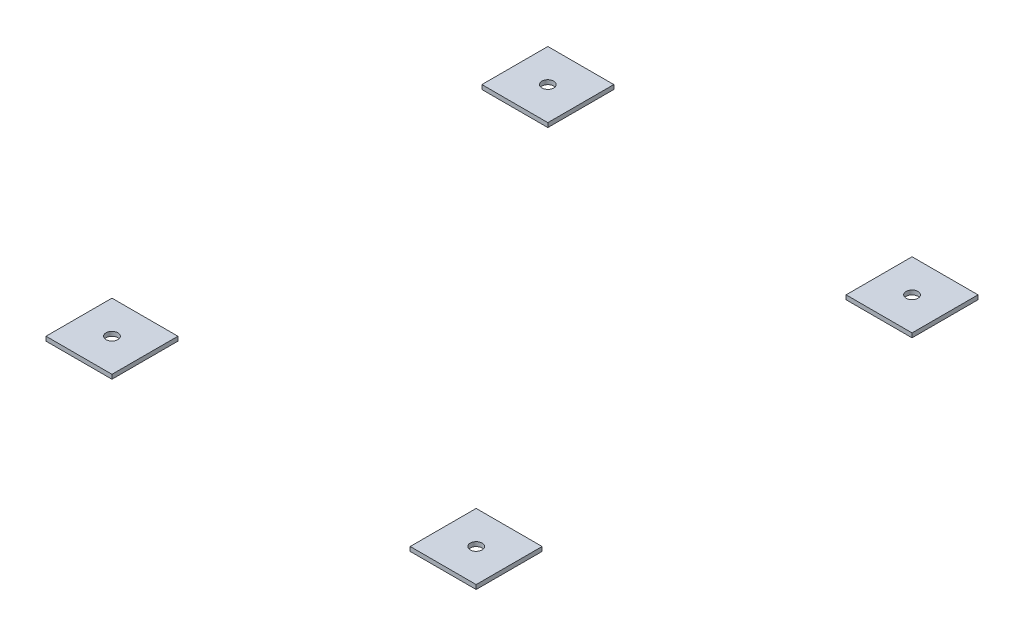
ISO-10303-21;
HEADER;
FILE_DESCRIPTION(('STEP AP214'),'2;1');
FILE_NAME('part.step','',(''),(''),'','','');
FILE_SCHEMA(('AUTOMOTIVE_DESIGN { 1 0 10303 214 1 1 1 1 }'));
ENDSEC;
DATA;
#1=APPLICATION_CONTEXT('core data for automotive mechanical design processes');
#2=APPLICATION_PROTOCOL_DEFINITION('international standard','automotive_design',2000,#1);
#3=PRODUCT_CONTEXT('',#1,'mechanical');
#4=PRODUCT('Part','Part','',(#3));
#5=PRODUCT_RELATED_PRODUCT_CATEGORY('part','',(#4));
#6=PRODUCT_DEFINITION_FORMATION('','',#4);
#7=PRODUCT_DEFINITION_CONTEXT('part definition',#1,'design');
#8=PRODUCT_DEFINITION('design','',#6,#7);
#9=PRODUCT_DEFINITION_SHAPE('','',#8);
#10=(LENGTH_UNIT() NAMED_UNIT(*) SI_UNIT(.MILLI.,.METRE.));
#11=(NAMED_UNIT(*) PLANE_ANGLE_UNIT() SI_UNIT($,.RADIAN.));
#12=(NAMED_UNIT(*) SI_UNIT($,.STERADIAN.) SOLID_ANGLE_UNIT());
#13=UNCERTAINTY_MEASURE_WITH_UNIT(LENGTH_MEASURE(1.E-05),#10,'distance_accuracy_value','');
#14=(GEOMETRIC_REPRESENTATION_CONTEXT(3) GLOBAL_UNCERTAINTY_ASSIGNED_CONTEXT((#13)) GLOBAL_UNIT_ASSIGNED_CONTEXT((#10,
#11,#12)) REPRESENTATION_CONTEXT('',''));
#15=CARTESIAN_POINT('',(0.,0.,0.));
#16=DIRECTION('',(0.,0.,1.));
#17=DIRECTION('',(1.,0.,0.));
#18=AXIS2_PLACEMENT_3D('',#15,#16,#17);
#19=CARTESIAN_POINT('',(0.,1.5,0.));
#20=DIRECTION('',(0.,-1.,0.));
#21=DIRECTION('',(0.,0.,-1.));
#22=AXIS2_PLACEMENT_3D('',#19,#20,#21);
#23=PLANE('',#22);
#24=DIRECTION('',(0.,0.,1.));
#25=VECTOR('',#24,1.);
#26=CARTESIAN_POINT('',(-150.,1.5,175.));
#27=LINE('',#26,#25);
#28=CARTESIAN_POINT('',(-150.,1.5,129.));
#29=VERTEX_POINT('',#28);
#30=CARTESIAN_POINT('',(-150.,1.5,175.));
#31=VERTEX_POINT('',#30);
#32=EDGE_CURVE('E114',#29,#31,#27,.T.);
#33=ORIENTED_EDGE('',*,*,#32,.T.);
#34=DIRECTION('',(1.,0.,0.));
#35=VECTOR('',#34,1.);
#36=CARTESIAN_POINT('',(-150.,1.5,175.));
#37=LINE('',#36,#35);
#38=CARTESIAN_POINT('',(-104.,1.5,175.));
#39=VERTEX_POINT('',#38);
#40=EDGE_CURVE('E83',#31,#39,#37,.T.);
#41=ORIENTED_EDGE('',*,*,#40,.T.);
#42=DIRECTION('',(0.,0.,-1.));
#43=VECTOR('',#42,1.);
#44=CARTESIAN_POINT('',(-104.,1.5,175.));
#45=LINE('',#44,#43);
#46=CARTESIAN_POINT('',(-104.,1.5,129.));
#47=VERTEX_POINT('',#46);
#48=EDGE_CURVE('E122',#39,#47,#45,.T.);
#49=ORIENTED_EDGE('',*,*,#48,.T.);
#50=DIRECTION('',(-1.,0.,0.));
#51=VECTOR('',#50,1.);
#52=CARTESIAN_POINT('',(-150.,1.5,129.));
#53=LINE('',#52,#51);
#54=EDGE_CURVE('E107',#47,#29,#53,.T.);
#55=ORIENTED_EDGE('',*,*,#54,.T.);
#56=EDGE_LOOP('',(#33,#41,#49,#55));
#57=FACE_BOUND('',#56,.T.);
#58=CARTESIAN_POINT('',(-127.,1.5,152.));
#59=DIRECTION('',(0.,1.,0.));
#60=DIRECTION('',(0.,0.,1.));
#61=AXIS2_PLACEMENT_3D('',#58,#59,#60);
#62=CIRCLE('',#61,4.14);
#63=CARTESIAN_POINT('',(-127.,1.5,156.14));
#64=VERTEX_POINT('',#63);
#65=EDGE_CURVE('E54',#64,#64,#62,.T.);
#66=ORIENTED_EDGE('',*,*,#65,.F.);
#67=EDGE_LOOP('',(#66));
#68=FACE_BOUND('',#67,.T.);
#69=ADVANCED_FACE('F50',(#57,#68),#23,.F.);
#70=CARTESIAN_POINT('',(0.,-1.5,0.));
#71=DIRECTION('',(0.,-1.,0.));
#72=DIRECTION('',(0.,0.,-1.));
#73=AXIS2_PLACEMENT_3D('',#70,#71,#72);
#74=PLANE('',#73);
#75=DIRECTION('',(0.,0.,1.));
#76=VECTOR('',#75,1.);
#77=CARTESIAN_POINT('',(-150.,-1.5,175.));
#78=LINE('',#77,#76);
#79=CARTESIAN_POINT('',(-150.,-1.5,129.));
#80=VERTEX_POINT('',#79);
#81=CARTESIAN_POINT('',(-150.,-1.5,175.));
#82=VERTEX_POINT('',#81);
#83=EDGE_CURVE('E113',#80,#82,#78,.T.);
#84=ORIENTED_EDGE('',*,*,#83,.F.);
#85=DIRECTION('',(-1.,0.,0.));
#86=VECTOR('',#85,1.);
#87=CARTESIAN_POINT('',(-150.,-1.5,129.));
#88=LINE('',#87,#86);
#89=CARTESIAN_POINT('',(-104.,-1.5,129.));
#90=VERTEX_POINT('',#89);
#91=EDGE_CURVE('E93',#90,#80,#88,.T.);
#92=ORIENTED_EDGE('',*,*,#91,.F.);
#93=DIRECTION('',(0.,0.,-1.));
#94=VECTOR('',#93,1.);
#95=CARTESIAN_POINT('',(-104.,-1.5,175.));
#96=LINE('',#95,#94);
#97=CARTESIAN_POINT('',(-104.,-1.5,175.));
#98=VERTEX_POINT('',#97);
#99=EDGE_CURVE('E99',#98,#90,#96,.T.);
#100=ORIENTED_EDGE('',*,*,#99,.F.);
#101=DIRECTION('',(1.,0.,0.));
#102=VECTOR('',#101,1.);
#103=CARTESIAN_POINT('',(-150.,-1.5,175.));
#104=LINE('',#103,#102);
#105=EDGE_CURVE('E67',#82,#98,#104,.T.);
#106=ORIENTED_EDGE('',*,*,#105,.F.);
#107=EDGE_LOOP('',(#84,#92,#100,#106));
#108=FACE_BOUND('',#107,.T.);
#109=CARTESIAN_POINT('',(-127.,-1.5,152.));
#110=DIRECTION('',(0.,1.,0.));
#111=DIRECTION('',(0.,0.,1.));
#112=AXIS2_PLACEMENT_3D('',#109,#110,#111);
#113=CIRCLE('',#112,4.14);
#114=CARTESIAN_POINT('',(-127.,-1.5,156.14));
#115=VERTEX_POINT('',#114);
#116=EDGE_CURVE('E12',#115,#115,#113,.T.);
#117=ORIENTED_EDGE('',*,*,#116,.T.);
#118=EDGE_LOOP('',(#117));
#119=FACE_BOUND('',#118,.T.);
#120=ADVANCED_FACE('F110',(#108,#119),#74,.T.);
#121=CARTESIAN_POINT('',(-150.,1.5,175.));
#122=DIRECTION('',(1.,0.,0.));
#123=DIRECTION('',(0.,0.,-1.));
#124=AXIS2_PLACEMENT_3D('',#121,#122,#123);
#125=PLANE('',#124);
#126=ORIENTED_EDGE('',*,*,#83,.T.);
#127=DIRECTION('',(0.,-1.,0.));
#128=VECTOR('',#127,1.);
#129=CARTESIAN_POINT('',(-150.,1.5,175.));
#130=LINE('',#129,#128);
#131=EDGE_CURVE('E129',#31,#82,#130,.T.);
#132=ORIENTED_EDGE('',*,*,#131,.F.);
#133=ORIENTED_EDGE('',*,*,#32,.F.);
#134=DIRECTION('',(0.,-1.,0.));
#135=VECTOR('',#134,1.);
#136=CARTESIAN_POINT('',(-150.,1.5,129.));
#137=LINE('',#136,#135);
#138=EDGE_CURVE('E108',#29,#80,#137,.T.);
#139=ORIENTED_EDGE('',*,*,#138,.T.);
#140=EDGE_LOOP('',(#126,#132,#133,#139));
#141=FACE_BOUND('',#140,.T.);
#142=ADVANCED_FACE('F128',(#141),#125,.F.);
#143=CARTESIAN_POINT('',(-150.,1.5,175.));
#144=DIRECTION('',(0.,0.,-1.));
#145=DIRECTION('',(-1.,0.,0.));
#146=AXIS2_PLACEMENT_3D('',#143,#144,#145);
#147=PLANE('',#146);
#148=ORIENTED_EDGE('',*,*,#105,.T.);
#149=DIRECTION('',(0.,-1.,0.));
#150=VECTOR('',#149,1.);
#151=CARTESIAN_POINT('',(-104.,1.5,175.));
#152=LINE('',#151,#150);
#153=EDGE_CURVE('E104',#39,#98,#152,.T.);
#154=ORIENTED_EDGE('',*,*,#153,.F.);
#155=ORIENTED_EDGE('',*,*,#40,.F.);
#156=ORIENTED_EDGE('',*,*,#131,.T.);
#157=EDGE_LOOP('',(#148,#154,#155,#156));
#158=FACE_BOUND('',#157,.T.);
#159=ADVANCED_FACE('F132',(#158),#147,.F.);
#160=CARTESIAN_POINT('',(-104.,1.5,175.));
#161=DIRECTION('',(-1.,0.,0.));
#162=DIRECTION('',(0.,0.,1.));
#163=AXIS2_PLACEMENT_3D('',#160,#161,#162);
#164=PLANE('',#163);
#165=ORIENTED_EDGE('',*,*,#99,.T.);
#166=DIRECTION('',(0.,-1.,0.));
#167=VECTOR('',#166,1.);
#168=CARTESIAN_POINT('',(-104.,1.5,129.));
#169=LINE('',#168,#167);
#170=EDGE_CURVE('E102',#47,#90,#169,.T.);
#171=ORIENTED_EDGE('',*,*,#170,.F.);
#172=ORIENTED_EDGE('',*,*,#48,.F.);
#173=ORIENTED_EDGE('',*,*,#153,.T.);
#174=EDGE_LOOP('',(#165,#171,#172,#173));
#175=FACE_BOUND('',#174,.T.);
#176=ADVANCED_FACE('F100',(#175),#164,.F.);
#177=CARTESIAN_POINT('',(-150.,1.5,129.));
#178=DIRECTION('',(0.,0.,1.));
#179=DIRECTION('',(1.,0.,0.));
#180=AXIS2_PLACEMENT_3D('',#177,#178,#179);
#181=PLANE('',#180);
#182=ORIENTED_EDGE('',*,*,#91,.T.);
#183=ORIENTED_EDGE('',*,*,#138,.F.);
#184=ORIENTED_EDGE('',*,*,#54,.F.);
#185=ORIENTED_EDGE('',*,*,#170,.T.);
#186=EDGE_LOOP('',(#182,#183,#184,#185));
#187=FACE_BOUND('',#186,.T.);
#188=ADVANCED_FACE('F106',(#187),#181,.F.);
#189=CARTESIAN_POINT('',(-127.,1.5,152.));
#190=DIRECTION('',(0.,-1.,0.));
#191=DIRECTION('',(0.,0.,-1.));
#192=AXIS2_PLACEMENT_3D('',#189,#190,#191);
#193=CYLINDRICAL_SURFACE('',#192,4.14);
#194=ORIENTED_EDGE('',*,*,#65,.T.);
#195=EDGE_LOOP('',(#194));
#196=FACE_BOUND('',#195,.T.);
#197=ORIENTED_EDGE('',*,*,#116,.F.);
#198=EDGE_LOOP('',(#197));
#199=FACE_BOUND('',#198,.T.);
#200=ADVANCED_FACE('F52',(#196,#199),#193,.F.);
#201=CLOSED_SHELL('',(#69,#120,#142,#159,#176,#188,#200));
#202=MANIFOLD_SOLID_BREP('B2',#201);
#203=CARTESIAN_POINT('',(0.,1.5,0.));
#204=DIRECTION('',(0.,-1.,0.));
#205=DIRECTION('',(0.,0.,-1.));
#206=AXIS2_PLACEMENT_3D('',#203,#204,#205);
#207=PLANE('',#206);
#208=DIRECTION('',(0.,0.,1.));
#209=VECTOR('',#208,1.);
#210=CARTESIAN_POINT('',(104.,1.5,175.));
#211=LINE('',#210,#209);
#212=CARTESIAN_POINT('',(104.,1.5,129.));
#213=VERTEX_POINT('',#212);
#214=CARTESIAN_POINT('',(104.,1.5,175.));
#215=VERTEX_POINT('',#214);
#216=EDGE_CURVE('E269',#213,#215,#211,.T.);
#217=ORIENTED_EDGE('',*,*,#216,.T.);
#218=DIRECTION('',(1.,0.,0.));
#219=VECTOR('',#218,1.);
#220=CARTESIAN_POINT('',(104.,1.5,175.));
#221=LINE('',#220,#219);
#222=CARTESIAN_POINT('',(150.,1.5,175.));
#223=VERTEX_POINT('',#222);
#224=EDGE_CURVE('E238',#215,#223,#221,.T.);
#225=ORIENTED_EDGE('',*,*,#224,.T.);
#226=DIRECTION('',(0.,0.,-1.));
#227=VECTOR('',#226,1.);
#228=CARTESIAN_POINT('',(150.,1.5,175.));
#229=LINE('',#228,#227);
#230=CARTESIAN_POINT('',(150.,1.5,129.));
#231=VERTEX_POINT('',#230);
#232=EDGE_CURVE('E277',#223,#231,#229,.T.);
#233=ORIENTED_EDGE('',*,*,#232,.T.);
#234=DIRECTION('',(-1.,0.,0.));
#235=VECTOR('',#234,1.);
#236=CARTESIAN_POINT('',(104.,1.5,129.));
#237=LINE('',#236,#235);
#238=EDGE_CURVE('E262',#231,#213,#237,.T.);
#239=ORIENTED_EDGE('',*,*,#238,.T.);
#240=EDGE_LOOP('',(#217,#225,#233,#239));
#241=FACE_BOUND('',#240,.T.);
#242=CARTESIAN_POINT('',(127.,1.5,152.));
#243=DIRECTION('',(0.,1.,0.));
#244=DIRECTION('',(0.,0.,1.));
#245=AXIS2_PLACEMENT_3D('',#242,#243,#244);
#246=CIRCLE('',#245,4.14);
#247=CARTESIAN_POINT('',(127.,1.5,156.14));
#248=VERTEX_POINT('',#247);
#249=EDGE_CURVE('E209',#248,#248,#246,.T.);
#250=ORIENTED_EDGE('',*,*,#249,.F.);
#251=EDGE_LOOP('',(#250));
#252=FACE_BOUND('',#251,.T.);
#253=ADVANCED_FACE('F205',(#241,#252),#207,.F.);
#254=CARTESIAN_POINT('',(0.,-1.5,0.));
#255=DIRECTION('',(0.,-1.,0.));
#256=DIRECTION('',(0.,0.,-1.));
#257=AXIS2_PLACEMENT_3D('',#254,#255,#256);
#258=PLANE('',#257);
#259=DIRECTION('',(0.,0.,1.));
#260=VECTOR('',#259,1.);
#261=CARTESIAN_POINT('',(104.,-1.5,175.));
#262=LINE('',#261,#260);
#263=CARTESIAN_POINT('',(104.,-1.5,129.));
#264=VERTEX_POINT('',#263);
#265=CARTESIAN_POINT('',(104.,-1.5,175.));
#266=VERTEX_POINT('',#265);
#267=EDGE_CURVE('E268',#264,#266,#262,.T.);
#268=ORIENTED_EDGE('',*,*,#267,.F.);
#269=DIRECTION('',(-1.,0.,0.));
#270=VECTOR('',#269,1.);
#271=CARTESIAN_POINT('',(104.,-1.5,129.));
#272=LINE('',#271,#270);
#273=CARTESIAN_POINT('',(150.,-1.5,129.));
#274=VERTEX_POINT('',#273);
#275=EDGE_CURVE('E248',#274,#264,#272,.T.);
#276=ORIENTED_EDGE('',*,*,#275,.F.);
#277=DIRECTION('',(0.,0.,-1.));
#278=VECTOR('',#277,1.);
#279=CARTESIAN_POINT('',(150.,-1.5,175.));
#280=LINE('',#279,#278);
#281=CARTESIAN_POINT('',(150.,-1.5,175.));
#282=VERTEX_POINT('',#281);
#283=EDGE_CURVE('E254',#282,#274,#280,.T.);
#284=ORIENTED_EDGE('',*,*,#283,.F.);
#285=DIRECTION('',(1.,0.,0.));
#286=VECTOR('',#285,1.);
#287=CARTESIAN_POINT('',(104.,-1.5,175.));
#288=LINE('',#287,#286);
#289=EDGE_CURVE('E222',#266,#282,#288,.T.);
#290=ORIENTED_EDGE('',*,*,#289,.F.);
#291=EDGE_LOOP('',(#268,#276,#284,#290));
#292=FACE_BOUND('',#291,.T.);
#293=CARTESIAN_POINT('',(127.,-1.5,152.));
#294=DIRECTION('',(0.,1.,0.));
#295=DIRECTION('',(0.,0.,1.));
#296=AXIS2_PLACEMENT_3D('',#293,#294,#295);
#297=CIRCLE('',#296,4.14);
#298=CARTESIAN_POINT('',(127.,-1.5,156.14));
#299=VERTEX_POINT('',#298);
#300=EDGE_CURVE('E48',#299,#299,#297,.T.);
#301=ORIENTED_EDGE('',*,*,#300,.T.);
#302=EDGE_LOOP('',(#301));
#303=FACE_BOUND('',#302,.T.);
#304=ADVANCED_FACE('F265',(#292,#303),#258,.T.);
#305=CARTESIAN_POINT('',(104.,1.5,175.));
#306=DIRECTION('',(1.,0.,0.));
#307=DIRECTION('',(0.,0.,-1.));
#308=AXIS2_PLACEMENT_3D('',#305,#306,#307);
#309=PLANE('',#308);
#310=ORIENTED_EDGE('',*,*,#267,.T.);
#311=DIRECTION('',(0.,-1.,0.));
#312=VECTOR('',#311,1.);
#313=CARTESIAN_POINT('',(104.,1.5,175.));
#314=LINE('',#313,#312);
#315=EDGE_CURVE('E284',#215,#266,#314,.T.);
#316=ORIENTED_EDGE('',*,*,#315,.F.);
#317=ORIENTED_EDGE('',*,*,#216,.F.);
#318=DIRECTION('',(0.,-1.,0.));
#319=VECTOR('',#318,1.);
#320=CARTESIAN_POINT('',(104.,1.5,129.));
#321=LINE('',#320,#319);
#322=EDGE_CURVE('E263',#213,#264,#321,.T.);
#323=ORIENTED_EDGE('',*,*,#322,.T.);
#324=EDGE_LOOP('',(#310,#316,#317,#323));
#325=FACE_BOUND('',#324,.T.);
#326=ADVANCED_FACE('F283',(#325),#309,.F.);
#327=CARTESIAN_POINT('',(104.,1.5,175.));
#328=DIRECTION('',(0.,0.,-1.));
#329=DIRECTION('',(-1.,0.,0.));
#330=AXIS2_PLACEMENT_3D('',#327,#328,#329);
#331=PLANE('',#330);
#332=ORIENTED_EDGE('',*,*,#289,.T.);
#333=DIRECTION('',(0.,-1.,0.));
#334=VECTOR('',#333,1.);
#335=CARTESIAN_POINT('',(150.,1.5,175.));
#336=LINE('',#335,#334);
#337=EDGE_CURVE('E259',#223,#282,#336,.T.);
#338=ORIENTED_EDGE('',*,*,#337,.F.);
#339=ORIENTED_EDGE('',*,*,#224,.F.);
#340=ORIENTED_EDGE('',*,*,#315,.T.);
#341=EDGE_LOOP('',(#332,#338,#339,#340));
#342=FACE_BOUND('',#341,.T.);
#343=ADVANCED_FACE('F287',(#342),#331,.F.);
#344=CARTESIAN_POINT('',(150.,1.5,175.));
#345=DIRECTION('',(-1.,0.,0.));
#346=DIRECTION('',(0.,0.,1.));
#347=AXIS2_PLACEMENT_3D('',#344,#345,#346);
#348=PLANE('',#347);
#349=ORIENTED_EDGE('',*,*,#283,.T.);
#350=DIRECTION('',(0.,-1.,0.));
#351=VECTOR('',#350,1.);
#352=CARTESIAN_POINT('',(150.,1.5,129.));
#353=LINE('',#352,#351);
#354=EDGE_CURVE('E257',#231,#274,#353,.T.);
#355=ORIENTED_EDGE('',*,*,#354,.F.);
#356=ORIENTED_EDGE('',*,*,#232,.F.);
#357=ORIENTED_EDGE('',*,*,#337,.T.);
#358=EDGE_LOOP('',(#349,#355,#356,#357));
#359=FACE_BOUND('',#358,.T.);
#360=ADVANCED_FACE('F255',(#359),#348,.F.);
#361=CARTESIAN_POINT('',(104.,1.5,129.));
#362=DIRECTION('',(0.,0.,1.));
#363=DIRECTION('',(1.,0.,0.));
#364=AXIS2_PLACEMENT_3D('',#361,#362,#363);
#365=PLANE('',#364);
#366=ORIENTED_EDGE('',*,*,#275,.T.);
#367=ORIENTED_EDGE('',*,*,#322,.F.);
#368=ORIENTED_EDGE('',*,*,#238,.F.);
#369=ORIENTED_EDGE('',*,*,#354,.T.);
#370=EDGE_LOOP('',(#366,#367,#368,#369));
#371=FACE_BOUND('',#370,.T.);
#372=ADVANCED_FACE('F261',(#371),#365,.F.);
#373=CARTESIAN_POINT('',(127.,1.5,152.));
#374=DIRECTION('',(0.,-1.,0.));
#375=DIRECTION('',(0.,0.,-1.));
#376=AXIS2_PLACEMENT_3D('',#373,#374,#375);
#377=CYLINDRICAL_SURFACE('',#376,4.14);
#378=ORIENTED_EDGE('',*,*,#249,.T.);
#379=EDGE_LOOP('',(#378));
#380=FACE_BOUND('',#379,.T.);
#381=ORIENTED_EDGE('',*,*,#300,.F.);
#382=EDGE_LOOP('',(#381));
#383=FACE_BOUND('',#382,.T.);
#384=ADVANCED_FACE('F207',(#380,#383),#377,.F.);
#385=CLOSED_SHELL('',(#253,#304,#326,#343,#360,#372,#384));
#386=MANIFOLD_SOLID_BREP('B6',#385);
#387=CARTESIAN_POINT('',(0.,1.5,0.));
#388=DIRECTION('',(0.,-1.,0.));
#389=DIRECTION('',(0.,0.,-1.));
#390=AXIS2_PLACEMENT_3D('',#387,#388,#389);
#391=PLANE('',#390);
#392=DIRECTION('',(0.,0.,1.));
#393=VECTOR('',#392,1.);
#394=CARTESIAN_POINT('',(-150.,1.5,-129.));
#395=LINE('',#394,#393);
#396=CARTESIAN_POINT('',(-150.,1.5,-175.));
#397=VERTEX_POINT('',#396);
#398=CARTESIAN_POINT('',(-150.,1.5,-129.));
#399=VERTEX_POINT('',#398);
#400=EDGE_CURVE('E423',#397,#399,#395,.T.);
#401=ORIENTED_EDGE('',*,*,#400,.T.);
#402=DIRECTION('',(1.,0.,0.));
#403=VECTOR('',#402,1.);
#404=CARTESIAN_POINT('',(-150.,1.5,-129.));
#405=LINE('',#404,#403);
#406=CARTESIAN_POINT('',(-104.,1.5,-129.));
#407=VERTEX_POINT('',#406);
#408=EDGE_CURVE('E392',#399,#407,#405,.T.);
#409=ORIENTED_EDGE('',*,*,#408,.T.);
#410=DIRECTION('',(0.,0.,-1.));
#411=VECTOR('',#410,1.);
#412=CARTESIAN_POINT('',(-104.,1.5,-129.));
#413=LINE('',#412,#411);
#414=CARTESIAN_POINT('',(-104.,1.5,-175.));
#415=VERTEX_POINT('',#414);
#416=EDGE_CURVE('E431',#407,#415,#413,.T.);
#417=ORIENTED_EDGE('',*,*,#416,.T.);
#418=DIRECTION('',(-1.,0.,0.));
#419=VECTOR('',#418,1.);
#420=CARTESIAN_POINT('',(-150.,1.5,-175.));
#421=LINE('',#420,#419);
#422=EDGE_CURVE('E416',#415,#397,#421,.T.);
#423=ORIENTED_EDGE('',*,*,#422,.T.);
#424=EDGE_LOOP('',(#401,#409,#417,#423));
#425=FACE_BOUND('',#424,.T.);
#426=CARTESIAN_POINT('',(-127.,1.5,-152.));
#427=DIRECTION('',(0.,1.,0.));
#428=DIRECTION('',(0.,0.,1.));
#429=AXIS2_PLACEMENT_3D('',#426,#427,#428);
#430=CIRCLE('',#429,4.14);
#431=CARTESIAN_POINT('',(-127.,1.5,-147.86));
#432=VERTEX_POINT('',#431);
#433=EDGE_CURVE('E363',#432,#432,#430,.T.);
#434=ORIENTED_EDGE('',*,*,#433,.F.);
#435=EDGE_LOOP('',(#434));
#436=FACE_BOUND('',#435,.T.);
#437=ADVANCED_FACE('F359',(#425,#436),#391,.F.);
#438=CARTESIAN_POINT('',(0.,-1.5,0.));
#439=DIRECTION('',(0.,-1.,0.));
#440=DIRECTION('',(0.,0.,-1.));
#441=AXIS2_PLACEMENT_3D('',#438,#439,#440);
#442=PLANE('',#441);
#443=DIRECTION('',(0.,0.,1.));
#444=VECTOR('',#443,1.);
#445=CARTESIAN_POINT('',(-150.,-1.5,-129.));
#446=LINE('',#445,#444);
#447=CARTESIAN_POINT('',(-150.,-1.5,-175.));
#448=VERTEX_POINT('',#447);
#449=CARTESIAN_POINT('',(-150.,-1.5,-129.));
#450=VERTEX_POINT('',#449);
#451=EDGE_CURVE('E422',#448,#450,#446,.T.);
#452=ORIENTED_EDGE('',*,*,#451,.F.);
#453=DIRECTION('',(-1.,0.,0.));
#454=VECTOR('',#453,1.);
#455=CARTESIAN_POINT('',(-150.,-1.5,-175.));
#456=LINE('',#455,#454);
#457=CARTESIAN_POINT('',(-104.,-1.5,-175.));
#458=VERTEX_POINT('',#457);
#459=EDGE_CURVE('E402',#458,#448,#456,.T.);
#460=ORIENTED_EDGE('',*,*,#459,.F.);
#461=DIRECTION('',(0.,0.,-1.));
#462=VECTOR('',#461,1.);
#463=CARTESIAN_POINT('',(-104.,-1.5,-129.));
#464=LINE('',#463,#462);
#465=CARTESIAN_POINT('',(-104.,-1.5,-129.));
#466=VERTEX_POINT('',#465);
#467=EDGE_CURVE('E408',#466,#458,#464,.T.);
#468=ORIENTED_EDGE('',*,*,#467,.F.);
#469=DIRECTION('',(1.,0.,0.));
#470=VECTOR('',#469,1.);
#471=CARTESIAN_POINT('',(-150.,-1.5,-129.));
#472=LINE('',#471,#470);
#473=EDGE_CURVE('E376',#450,#466,#472,.T.);
#474=ORIENTED_EDGE('',*,*,#473,.F.);
#475=EDGE_LOOP('',(#452,#460,#468,#474));
#476=FACE_BOUND('',#475,.T.);
#477=CARTESIAN_POINT('',(-127.,-1.5,-152.));
#478=DIRECTION('',(0.,1.,0.));
#479=DIRECTION('',(0.,0.,1.));
#480=AXIS2_PLACEMENT_3D('',#477,#478,#479);
#481=CIRCLE('',#480,4.14);
#482=CARTESIAN_POINT('',(-127.,-1.5,-147.86));
#483=VERTEX_POINT('',#482);
#484=EDGE_CURVE('E203',#483,#483,#481,.T.);
#485=ORIENTED_EDGE('',*,*,#484,.T.);
#486=EDGE_LOOP('',(#485));
#487=FACE_BOUND('',#486,.T.);
#488=ADVANCED_FACE('F419',(#476,#487),#442,.T.);
#489=CARTESIAN_POINT('',(-150.,1.5,-129.));
#490=DIRECTION('',(1.,0.,0.));
#491=DIRECTION('',(0.,0.,-1.));
#492=AXIS2_PLACEMENT_3D('',#489,#490,#491);
#493=PLANE('',#492);
#494=ORIENTED_EDGE('',*,*,#451,.T.);
#495=DIRECTION('',(0.,-1.,0.));
#496=VECTOR('',#495,1.);
#497=CARTESIAN_POINT('',(-150.,1.5,-129.));
#498=LINE('',#497,#496);
#499=EDGE_CURVE('E438',#399,#450,#498,.T.);
#500=ORIENTED_EDGE('',*,*,#499,.F.);
#501=ORIENTED_EDGE('',*,*,#400,.F.);
#502=DIRECTION('',(0.,-1.,0.));
#503=VECTOR('',#502,1.);
#504=CARTESIAN_POINT('',(-150.,1.5,-175.));
#505=LINE('',#504,#503);
#506=EDGE_CURVE('E417',#397,#448,#505,.T.);
#507=ORIENTED_EDGE('',*,*,#506,.T.);
#508=EDGE_LOOP('',(#494,#500,#501,#507));
#509=FACE_BOUND('',#508,.T.);
#510=ADVANCED_FACE('F437',(#509),#493,.F.);
#511=CARTESIAN_POINT('',(-150.,1.5,-129.));
#512=DIRECTION('',(0.,0.,-1.));
#513=DIRECTION('',(-1.,0.,0.));
#514=AXIS2_PLACEMENT_3D('',#511,#512,#513);
#515=PLANE('',#514);
#516=ORIENTED_EDGE('',*,*,#473,.T.);
#517=DIRECTION('',(0.,-1.,0.));
#518=VECTOR('',#517,1.);
#519=CARTESIAN_POINT('',(-104.,1.5,-129.));
#520=LINE('',#519,#518);
#521=EDGE_CURVE('E413',#407,#466,#520,.T.);
#522=ORIENTED_EDGE('',*,*,#521,.F.);
#523=ORIENTED_EDGE('',*,*,#408,.F.);
#524=ORIENTED_EDGE('',*,*,#499,.T.);
#525=EDGE_LOOP('',(#516,#522,#523,#524));
#526=FACE_BOUND('',#525,.T.);
#527=ADVANCED_FACE('F441',(#526),#515,.F.);
#528=CARTESIAN_POINT('',(-104.,1.5,-129.));
#529=DIRECTION('',(-1.,0.,0.));
#530=DIRECTION('',(0.,0.,1.));
#531=AXIS2_PLACEMENT_3D('',#528,#529,#530);
#532=PLANE('',#531);
#533=ORIENTED_EDGE('',*,*,#467,.T.);
#534=DIRECTION('',(0.,-1.,0.));
#535=VECTOR('',#534,1.);
#536=CARTESIAN_POINT('',(-104.,1.5,-175.));
#537=LINE('',#536,#535);
#538=EDGE_CURVE('E411',#415,#458,#537,.T.);
#539=ORIENTED_EDGE('',*,*,#538,.F.);
#540=ORIENTED_EDGE('',*,*,#416,.F.);
#541=ORIENTED_EDGE('',*,*,#521,.T.);
#542=EDGE_LOOP('',(#533,#539,#540,#541));
#543=FACE_BOUND('',#542,.T.);
#544=ADVANCED_FACE('F409',(#543),#532,.F.);
#545=CARTESIAN_POINT('',(-150.,1.5,-175.));
#546=DIRECTION('',(0.,0.,1.));
#547=DIRECTION('',(1.,0.,0.));
#548=AXIS2_PLACEMENT_3D('',#545,#546,#547);
#549=PLANE('',#548);
#550=ORIENTED_EDGE('',*,*,#459,.T.);
#551=ORIENTED_EDGE('',*,*,#506,.F.);
#552=ORIENTED_EDGE('',*,*,#422,.F.);
#553=ORIENTED_EDGE('',*,*,#538,.T.);
#554=EDGE_LOOP('',(#550,#551,#552,#553));
#555=FACE_BOUND('',#554,.T.);
#556=ADVANCED_FACE('F415',(#555),#549,.F.);
#557=CARTESIAN_POINT('',(-127.,1.5,-152.));
#558=DIRECTION('',(0.,-1.,0.));
#559=DIRECTION('',(0.,0.,-1.));
#560=AXIS2_PLACEMENT_3D('',#557,#558,#559);
#561=CYLINDRICAL_SURFACE('',#560,4.14);
#562=ORIENTED_EDGE('',*,*,#433,.T.);
#563=EDGE_LOOP('',(#562));
#564=FACE_BOUND('',#563,.T.);
#565=ORIENTED_EDGE('',*,*,#484,.F.);
#566=EDGE_LOOP('',(#565));
#567=FACE_BOUND('',#566,.T.);
#568=ADVANCED_FACE('F361',(#564,#567),#561,.F.);
#569=CLOSED_SHELL('',(#437,#488,#510,#527,#544,#556,#568));
#570=MANIFOLD_SOLID_BREP('B42',#569);
#571=CARTESIAN_POINT('',(0.,1.5,0.));
#572=DIRECTION('',(0.,-1.,0.));
#573=DIRECTION('',(0.,0.,-1.));
#574=AXIS2_PLACEMENT_3D('',#571,#572,#573);
#575=PLANE('',#574);
#576=DIRECTION('',(0.,0.,1.));
#577=VECTOR('',#576,1.);
#578=CARTESIAN_POINT('',(104.,1.5,-129.));
#579=LINE('',#578,#577);
#580=CARTESIAN_POINT('',(104.,1.5,-175.));
#581=VERTEX_POINT('',#580);
#582=CARTESIAN_POINT('',(104.,1.5,-129.));
#583=VERTEX_POINT('',#582);
#584=EDGE_CURVE('E556',#581,#583,#579,.T.);
#585=ORIENTED_EDGE('',*,*,#584,.T.);
#586=DIRECTION('',(1.,0.,0.));
#587=VECTOR('',#586,1.);
#588=CARTESIAN_POINT('',(104.,1.5,-129.));
#589=LINE('',#588,#587);
#590=CARTESIAN_POINT('',(150.,1.5,-129.));
#591=VERTEX_POINT('',#590);
#592=EDGE_CURVE('E551',#583,#591,#589,.T.);
#593=ORIENTED_EDGE('',*,*,#592,.T.);
#594=DIRECTION('',(0.,0.,-1.));
#595=VECTOR('',#594,1.);
#596=CARTESIAN_POINT('',(150.,1.5,-129.));
#597=LINE('',#596,#595);
#598=CARTESIAN_POINT('',(150.,1.5,-175.));
#599=VERTEX_POINT('',#598);
#600=EDGE_CURVE('E554',#591,#599,#597,.T.);
#601=ORIENTED_EDGE('',*,*,#600,.T.);
#602=DIRECTION('',(-1.,0.,0.));
#603=VECTOR('',#602,1.);
#604=CARTESIAN_POINT('',(104.,1.5,-175.));
#605=LINE('',#604,#603);
#606=EDGE_CURVE('E521',#599,#581,#605,.T.);
#607=ORIENTED_EDGE('',*,*,#606,.T.);
#608=EDGE_LOOP('',(#585,#593,#601,#607));
#609=FACE_BOUND('',#608,.T.);
#610=CARTESIAN_POINT('',(127.,1.5,-152.));
#611=DIRECTION('',(0.,1.,0.));
#612=DIRECTION('',(0.,0.,1.));
#613=AXIS2_PLACEMENT_3D('',#610,#611,#612);
#614=CIRCLE('',#613,4.14);
#615=CARTESIAN_POINT('',(127.,1.5,-147.86));
#616=VERTEX_POINT('',#615);
#617=EDGE_CURVE('E571',#616,#616,#614,.T.);
#618=ORIENTED_EDGE('',*,*,#617,.F.);
#619=EDGE_LOOP('',(#618));
#620=FACE_BOUND('',#619,.T.);
#621=ADVANCED_FACE('F504',(#609,#620),#575,.F.);
#622=CARTESIAN_POINT('',(0.,-1.5,0.));
#623=DIRECTION('',(0.,-1.,0.));
#624=DIRECTION('',(0.,0.,-1.));
#625=AXIS2_PLACEMENT_3D('',#622,#623,#624);
#626=PLANE('',#625);
#627=DIRECTION('',(0.,0.,1.));
#628=VECTOR('',#627,1.);
#629=CARTESIAN_POINT('',(104.,-1.5,-129.));
#630=LINE('',#629,#628);
#631=CARTESIAN_POINT('',(104.,-1.5,-175.));
#632=VERTEX_POINT('',#631);
#633=CARTESIAN_POINT('',(104.,-1.5,-129.));
#634=VERTEX_POINT('',#633);
#635=EDGE_CURVE('E568',#632,#634,#630,.T.);
#636=ORIENTED_EDGE('',*,*,#635,.F.);
#637=DIRECTION('',(-1.,0.,0.));
#638=VECTOR('',#637,1.);
#639=CARTESIAN_POINT('',(104.,-1.5,-175.));
#640=LINE('',#639,#638);
#641=CARTESIAN_POINT('',(150.,-1.5,-175.));
#642=VERTEX_POINT('',#641);
#643=EDGE_CURVE('E544',#642,#632,#640,.T.);
#644=ORIENTED_EDGE('',*,*,#643,.F.);
#645=DIRECTION('',(0.,0.,-1.));
#646=VECTOR('',#645,1.);
#647=CARTESIAN_POINT('',(150.,-1.5,-129.));
#648=LINE('',#647,#646);
#649=CARTESIAN_POINT('',(150.,-1.5,-129.));
#650=VERTEX_POINT('',#649);
#651=EDGE_CURVE('E538',#650,#642,#648,.T.);
#652=ORIENTED_EDGE('',*,*,#651,.F.);
#653=DIRECTION('',(1.,0.,0.));
#654=VECTOR('',#653,1.);
#655=CARTESIAN_POINT('',(104.,-1.5,-129.));
#656=LINE('',#655,#654);
#657=EDGE_CURVE('E560',#634,#650,#656,.T.);
#658=ORIENTED_EDGE('',*,*,#657,.F.);
#659=EDGE_LOOP('',(#636,#644,#652,#658));
#660=FACE_BOUND('',#659,.T.);
#661=CARTESIAN_POINT('',(127.,-1.5,-152.));
#662=DIRECTION('',(0.,1.,0.));
#663=DIRECTION('',(0.,0.,1.));
#664=AXIS2_PLACEMENT_3D('',#661,#662,#663);
#665=CIRCLE('',#664,4.14);
#666=CARTESIAN_POINT('',(127.,-1.5,-147.86));
#667=VERTEX_POINT('',#666);
#668=EDGE_CURVE('E583',#667,#667,#665,.T.);
#669=ORIENTED_EDGE('',*,*,#668,.T.);
#670=EDGE_LOOP('',(#669));
#671=FACE_BOUND('',#670,.T.);
#672=ADVANCED_FACE('F579',(#660,#671),#626,.T.);
#673=CARTESIAN_POINT('',(104.,1.5,-129.));
#674=DIRECTION('',(1.,0.,0.));
#675=DIRECTION('',(0.,0.,-1.));
#676=AXIS2_PLACEMENT_3D('',#673,#674,#675);
#677=PLANE('',#676);
#678=ORIENTED_EDGE('',*,*,#635,.T.);
#679=DIRECTION('',(0.,-1.,0.));
#680=VECTOR('',#679,1.);
#681=CARTESIAN_POINT('',(104.,1.5,-129.));
#682=LINE('',#681,#680);
#683=EDGE_CURVE('E357',#583,#634,#682,.T.);
#684=ORIENTED_EDGE('',*,*,#683,.F.);
#685=ORIENTED_EDGE('',*,*,#584,.F.);
#686=DIRECTION('',(0.,-1.,0.));
#687=VECTOR('',#686,1.);
#688=CARTESIAN_POINT('',(104.,1.5,-175.));
#689=LINE('',#688,#687);
#690=EDGE_CURVE('E564',#581,#632,#689,.T.);
#691=ORIENTED_EDGE('',*,*,#690,.T.);
#692=EDGE_LOOP('',(#678,#684,#685,#691));
#693=FACE_BOUND('',#692,.T.);
#694=ADVANCED_FACE('F506',(#693),#677,.F.);
#695=CARTESIAN_POINT('',(104.,1.5,-129.));
#696=DIRECTION('',(0.,0.,-1.));
#697=DIRECTION('',(-1.,0.,0.));
#698=AXIS2_PLACEMENT_3D('',#695,#696,#697);
#699=PLANE('',#698);
#700=ORIENTED_EDGE('',*,*,#657,.T.);
#701=DIRECTION('',(0.,-1.,0.));
#702=VECTOR('',#701,1.);
#703=CARTESIAN_POINT('',(150.,1.5,-129.));
#704=LINE('',#703,#702);
#705=EDGE_CURVE('E513',#591,#650,#704,.T.);
#706=ORIENTED_EDGE('',*,*,#705,.F.);
#707=ORIENTED_EDGE('',*,*,#592,.F.);
#708=ORIENTED_EDGE('',*,*,#683,.T.);
#709=EDGE_LOOP('',(#700,#706,#707,#708));
#710=FACE_BOUND('',#709,.T.);
#711=ADVANCED_FACE('F559',(#710),#699,.F.);
#712=CARTESIAN_POINT('',(150.,1.5,-129.));
#713=DIRECTION('',(-1.,0.,0.));
#714=DIRECTION('',(0.,0.,1.));
#715=AXIS2_PLACEMENT_3D('',#712,#713,#714);
#716=PLANE('',#715);
#717=ORIENTED_EDGE('',*,*,#651,.T.);
#718=DIRECTION('',(0.,-1.,0.));
#719=VECTOR('',#718,1.);
#720=CARTESIAN_POINT('',(150.,1.5,-175.));
#721=LINE('',#720,#719);
#722=EDGE_CURVE('E561',#599,#642,#721,.T.);
#723=ORIENTED_EDGE('',*,*,#722,.F.);
#724=ORIENTED_EDGE('',*,*,#600,.F.);
#725=ORIENTED_EDGE('',*,*,#705,.T.);
#726=EDGE_LOOP('',(#717,#723,#724,#725));
#727=FACE_BOUND('',#726,.T.);
#728=ADVANCED_FACE('F562',(#727),#716,.F.);
#729=CARTESIAN_POINT('',(104.,1.5,-175.));
#730=DIRECTION('',(0.,0.,1.));
#731=DIRECTION('',(1.,0.,0.));
#732=AXIS2_PLACEMENT_3D('',#729,#730,#731);
#733=PLANE('',#732);
#734=ORIENTED_EDGE('',*,*,#643,.T.);
#735=ORIENTED_EDGE('',*,*,#690,.F.);
#736=ORIENTED_EDGE('',*,*,#606,.F.);
#737=ORIENTED_EDGE('',*,*,#722,.T.);
#738=EDGE_LOOP('',(#734,#735,#736,#737));
#739=FACE_BOUND('',#738,.T.);
#740=ADVANCED_FACE('F576',(#739),#733,.F.);
#741=CARTESIAN_POINT('',(127.,1.5,-152.));
#742=DIRECTION('',(0.,-1.,0.));
#743=DIRECTION('',(0.,0.,-1.));
#744=AXIS2_PLACEMENT_3D('',#741,#742,#743);
#745=CYLINDRICAL_SURFACE('',#744,4.14);
#746=ORIENTED_EDGE('',*,*,#617,.T.);
#747=EDGE_LOOP('',(#746));
#748=FACE_BOUND('',#747,.T.);
#749=ORIENTED_EDGE('',*,*,#668,.F.);
#750=EDGE_LOOP('',(#749));
#751=FACE_BOUND('',#750,.T.);
#752=ADVANCED_FACE('F589',(#748,#751),#745,.F.);
#753=CLOSED_SHELL('',(#621,#672,#694,#711,#728,#740,#752));
#754=MANIFOLD_SOLID_BREP('B197',#753);
#755=ADVANCED_BREP_SHAPE_REPRESENTATION('',(#18,#202,#386,#570,#754),#14);
#756=SHAPE_DEFINITION_REPRESENTATION(#9,#755);
ENDSEC;
END-ISO-10303-21;
